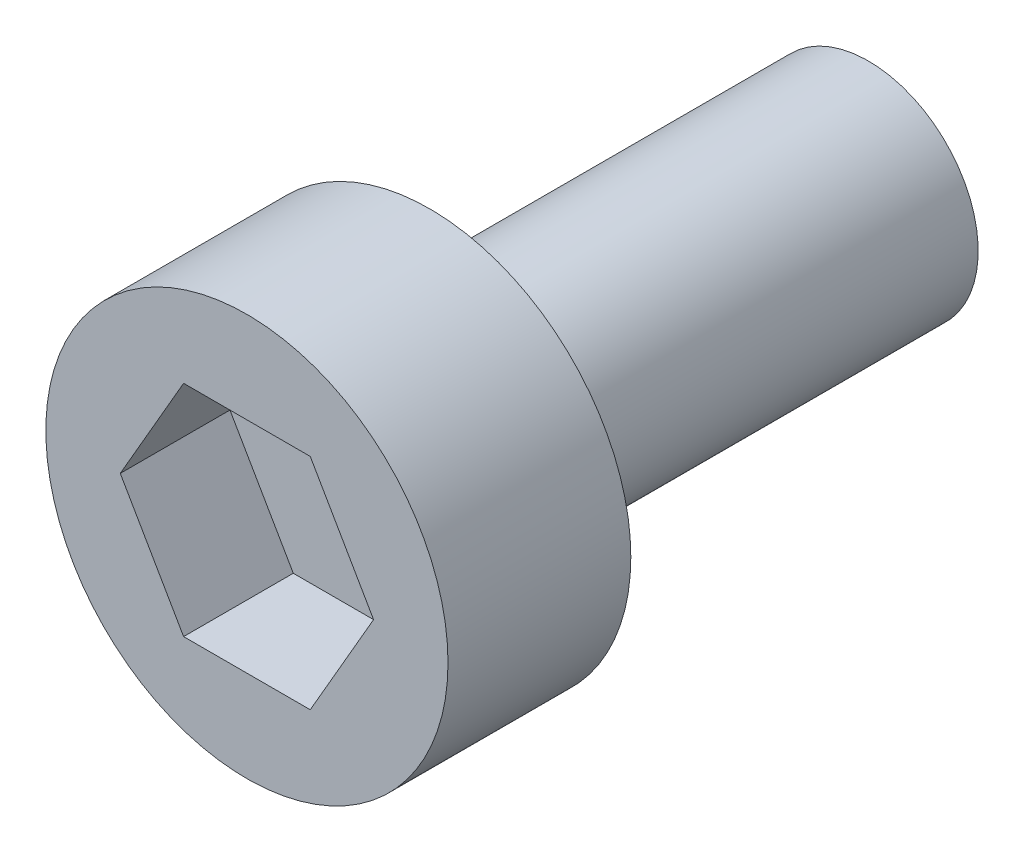
ISO-10303-21;
HEADER;
FILE_DESCRIPTION(('STEP AP214'),'2;1');
FILE_NAME('part.step','',(''),(''),'','','');
FILE_SCHEMA(('AUTOMOTIVE_DESIGN { 1 0 10303 214 1 1 1 1 }'));
ENDSEC;
DATA;
#1=APPLICATION_CONTEXT('core data for automotive mechanical design processes');
#2=APPLICATION_PROTOCOL_DEFINITION('international standard','automotive_design',2000,#1);
#3=PRODUCT_CONTEXT('',#1,'mechanical');
#4=PRODUCT('Part','Part','',(#3));
#5=PRODUCT_RELATED_PRODUCT_CATEGORY('part','',(#4));
#6=PRODUCT_DEFINITION_FORMATION('','',#4);
#7=PRODUCT_DEFINITION_CONTEXT('part definition',#1,'design');
#8=PRODUCT_DEFINITION('design','',#6,#7);
#9=PRODUCT_DEFINITION_SHAPE('','',#8);
#10=(LENGTH_UNIT() NAMED_UNIT(*) SI_UNIT(.MILLI.,.METRE.));
#11=(NAMED_UNIT(*) PLANE_ANGLE_UNIT() SI_UNIT($,.RADIAN.));
#12=(NAMED_UNIT(*) SI_UNIT($,.STERADIAN.) SOLID_ANGLE_UNIT());
#13=UNCERTAINTY_MEASURE_WITH_UNIT(LENGTH_MEASURE(1.E-05),#10,'distance_accuracy_value','');
#14=(GEOMETRIC_REPRESENTATION_CONTEXT(3) GLOBAL_UNCERTAINTY_ASSIGNED_CONTEXT((#13)) GLOBAL_UNIT_ASSIGNED_CONTEXT((#10,
#11,#12)) REPRESENTATION_CONTEXT('',''));
#15=CARTESIAN_POINT('',(0.,0.,0.));
#16=DIRECTION('',(0.,0.,1.));
#17=DIRECTION('',(1.,0.,0.));
#18=AXIS2_PLACEMENT_3D('',#15,#16,#17);
#19=CARTESIAN_POINT('',(0.866025403784438,-1.5,2.5));
#20=DIRECTION('',(-0.866025403784439,0.5,0.));
#21=DIRECTION('',(-0.5,-0.866025403784439,0.));
#22=AXIS2_PLACEMENT_3D('',#19,#20,#21);
#23=PLANE('',#22);
#24=DIRECTION('',(0.,0.,-1.));
#25=VECTOR('',#24,1.);
#26=CARTESIAN_POINT('',(1.73205080756888,0.,2.5));
#27=LINE('',#26,#25);
#28=CARTESIAN_POINT('',(1.73205080756888,0.,2.5));
#29=VERTEX_POINT('',#28);
#30=CARTESIAN_POINT('',(1.73205080756888,0.,1.));
#31=VERTEX_POINT('',#30);
#32=EDGE_CURVE('E115',#29,#31,#27,.T.);
#33=ORIENTED_EDGE('',*,*,#32,.T.);
#34=DIRECTION('',(-0.5,-0.866025403784439,0.));
#35=VECTOR('',#34,1.);
#36=CARTESIAN_POINT('',(1.29903810567666,-0.75,1.));
#37=LINE('',#36,#35);
#38=CARTESIAN_POINT('',(0.866025403784438,-1.5,1.));
#39=VERTEX_POINT('',#38);
#40=EDGE_CURVE('E176',#31,#39,#37,.T.);
#41=ORIENTED_EDGE('',*,*,#40,.T.);
#42=DIRECTION('',(0.,0.,-1.));
#43=VECTOR('',#42,1.);
#44=CARTESIAN_POINT('',(0.866025403784438,-1.5,2.5));
#45=LINE('',#44,#43);
#46=CARTESIAN_POINT('',(0.866025403784438,-1.5,2.5));
#47=VERTEX_POINT('',#46);
#48=EDGE_CURVE('E193',#47,#39,#45,.T.);
#49=ORIENTED_EDGE('',*,*,#48,.F.);
#50=DIRECTION('',(0.5,0.866025403784439,0.));
#51=VECTOR('',#50,1.);
#52=CARTESIAN_POINT('',(0.866025403784438,-1.5,2.5));
#53=LINE('',#52,#51);
#54=EDGE_CURVE('E182',#47,#29,#53,.T.);
#55=ORIENTED_EDGE('',*,*,#54,.T.);
#56=EDGE_LOOP('',(#33,#41,#49,#55));
#57=FACE_BOUND('',#56,.T.);
#58=ADVANCED_FACE('F36',(#57),#23,.T.);
#59=CARTESIAN_POINT('',(1.73205080756888,0.,2.5));
#60=DIRECTION('',(-0.866025403784438,-0.5,0.));
#61=DIRECTION('',(0.5,-0.866025403784438,0.));
#62=AXIS2_PLACEMENT_3D('',#59,#60,#61);
#63=PLANE('',#62);
#64=DIRECTION('',(0.,0.,-1.));
#65=VECTOR('',#64,1.);
#66=CARTESIAN_POINT('',(0.866025403784438,1.5,2.5));
#67=LINE('',#66,#65);
#68=CARTESIAN_POINT('',(0.866025403784438,1.5,2.5));
#69=VERTEX_POINT('',#68);
#70=CARTESIAN_POINT('',(0.866025403784438,1.5,1.));
#71=VERTEX_POINT('',#70);
#72=EDGE_CURVE('E113',#69,#71,#67,.T.);
#73=ORIENTED_EDGE('',*,*,#72,.T.);
#74=DIRECTION('',(0.5,-0.866025403784438,0.));
#75=VECTOR('',#74,1.);
#76=CARTESIAN_POINT('',(1.29903810567666,0.750000000000001,1.));
#77=LINE('',#76,#75);
#78=EDGE_CURVE('E94',#71,#31,#77,.T.);
#79=ORIENTED_EDGE('',*,*,#78,.T.);
#80=ORIENTED_EDGE('',*,*,#32,.F.);
#81=DIRECTION('',(-0.5,0.866025403784438,0.));
#82=VECTOR('',#81,1.);
#83=CARTESIAN_POINT('',(1.73205080756888,0.,2.5));
#84=LINE('',#83,#82);
#85=EDGE_CURVE('E184',#29,#69,#84,.T.);
#86=ORIENTED_EDGE('',*,*,#85,.T.);
#87=EDGE_LOOP('',(#73,#79,#80,#86));
#88=FACE_BOUND('',#87,.T.);
#89=ADVANCED_FACE('F141',(#88),#63,.T.);
#90=CARTESIAN_POINT('',(0.866025403784438,1.5,2.5));
#91=DIRECTION('',(0.,-1.,0.));
#92=DIRECTION('',(0.,0.,-1.));
#93=AXIS2_PLACEMENT_3D('',#90,#91,#92);
#94=PLANE('',#93);
#95=DIRECTION('',(0.,0.,-1.));
#96=VECTOR('',#95,1.);
#97=CARTESIAN_POINT('',(-0.866025403784439,1.5,2.5));
#98=LINE('',#97,#96);
#99=CARTESIAN_POINT('',(-0.866025403784439,1.5,2.5));
#100=VERTEX_POINT('',#99);
#101=CARTESIAN_POINT('',(-0.866025403784439,1.5,1.));
#102=VERTEX_POINT('',#101);
#103=EDGE_CURVE('E104',#100,#102,#98,.T.);
#104=ORIENTED_EDGE('',*,*,#103,.T.);
#105=DIRECTION('',(1.,0.,0.));
#106=VECTOR('',#105,1.);
#107=CARTESIAN_POINT('',(0.,1.5,1.));
#108=LINE('',#107,#106);
#109=EDGE_CURVE('E89',#102,#71,#108,.T.);
#110=ORIENTED_EDGE('',*,*,#109,.T.);
#111=ORIENTED_EDGE('',*,*,#72,.F.);
#112=DIRECTION('',(-1.,0.,0.));
#113=VECTOR('',#112,1.);
#114=CARTESIAN_POINT('',(0.866025403784438,1.5,2.5));
#115=LINE('',#114,#113);
#116=EDGE_CURVE('E112',#69,#100,#115,.T.);
#117=ORIENTED_EDGE('',*,*,#116,.T.);
#118=EDGE_LOOP('',(#104,#110,#111,#117));
#119=FACE_BOUND('',#118,.T.);
#120=ADVANCED_FACE('F110',(#119),#94,.T.);
#121=CARTESIAN_POINT('',(-0.866025403784439,1.5,2.5));
#122=DIRECTION('',(0.866025403784439,-0.5,0.));
#123=DIRECTION('',(0.5,0.866025403784439,0.));
#124=AXIS2_PLACEMENT_3D('',#121,#122,#123);
#125=PLANE('',#124);
#126=DIRECTION('',(0.,0.,-1.));
#127=VECTOR('',#126,1.);
#128=CARTESIAN_POINT('',(-1.73205080756888,0.,2.5));
#129=LINE('',#128,#127);
#130=CARTESIAN_POINT('',(-1.73205080756888,0.,2.5));
#131=VERTEX_POINT('',#130);
#132=CARTESIAN_POINT('',(-1.73205080756888,0.,1.));
#133=VERTEX_POINT('',#132);
#134=EDGE_CURVE('E107',#131,#133,#129,.T.);
#135=ORIENTED_EDGE('',*,*,#134,.T.);
#136=DIRECTION('',(0.5,0.866025403784439,0.));
#137=VECTOR('',#136,1.);
#138=CARTESIAN_POINT('',(-1.29903810567666,0.75,1.));
#139=LINE('',#138,#137);
#140=EDGE_CURVE('E92',#133,#102,#139,.T.);
#141=ORIENTED_EDGE('',*,*,#140,.T.);
#142=ORIENTED_EDGE('',*,*,#103,.F.);
#143=DIRECTION('',(-0.5,-0.866025403784439,0.));
#144=VECTOR('',#143,1.);
#145=CARTESIAN_POINT('',(-0.866025403784439,1.5,2.5));
#146=LINE('',#145,#144);
#147=EDGE_CURVE('E187',#100,#131,#146,.T.);
#148=ORIENTED_EDGE('',*,*,#147,.T.);
#149=EDGE_LOOP('',(#135,#141,#142,#148));
#150=FACE_BOUND('',#149,.T.);
#151=ADVANCED_FACE('F103',(#150),#125,.T.);
#152=CARTESIAN_POINT('',(-1.73205080756888,0.,2.5));
#153=DIRECTION('',(0.866025403784438,0.5,0.));
#154=DIRECTION('',(-0.5,0.866025403784439,0.));
#155=AXIS2_PLACEMENT_3D('',#152,#153,#154);
#156=PLANE('',#155);
#157=DIRECTION('',(0.,0.,-1.));
#158=VECTOR('',#157,1.);
#159=CARTESIAN_POINT('',(-0.866025403784438,-1.5,2.5));
#160=LINE('',#159,#158);
#161=CARTESIAN_POINT('',(-0.866025403784438,-1.5,2.5));
#162=VERTEX_POINT('',#161);
#163=CARTESIAN_POINT('',(-0.866025403784438,-1.5,1.));
#164=VERTEX_POINT('',#163);
#165=EDGE_CURVE('E60',#162,#164,#160,.T.);
#166=ORIENTED_EDGE('',*,*,#165,.T.);
#167=DIRECTION('',(-0.5,0.866025403784439,0.));
#168=VECTOR('',#167,1.);
#169=CARTESIAN_POINT('',(-1.29903810567666,-0.75,1.));
#170=LINE('',#169,#168);
#171=EDGE_CURVE('E53',#164,#133,#170,.T.);
#172=ORIENTED_EDGE('',*,*,#171,.T.);
#173=ORIENTED_EDGE('',*,*,#134,.F.);
#174=DIRECTION('',(0.5,-0.866025403784438,0.));
#175=VECTOR('',#174,1.);
#176=CARTESIAN_POINT('',(-1.73205080756888,0.,2.5));
#177=LINE('',#176,#175);
#178=EDGE_CURVE('E189',#131,#162,#177,.T.);
#179=ORIENTED_EDGE('',*,*,#178,.T.);
#180=EDGE_LOOP('',(#166,#172,#173,#179));
#181=FACE_BOUND('',#180,.T.);
#182=ADVANCED_FACE('F154',(#181),#156,.T.);
#183=CARTESIAN_POINT('',(-0.866025403784438,-1.5,2.5));
#184=DIRECTION('',(0.,1.,0.));
#185=DIRECTION('',(-1.,0.,0.));
#186=AXIS2_PLACEMENT_3D('',#183,#184,#185);
#187=PLANE('',#186);
#188=ORIENTED_EDGE('',*,*,#48,.T.);
#189=DIRECTION('',(-1.,0.,0.));
#190=VECTOR('',#189,1.);
#191=CARTESIAN_POINT('',(0.,-1.5,1.));
#192=LINE('',#191,#190);
#193=EDGE_CURVE('E179',#39,#164,#192,.T.);
#194=ORIENTED_EDGE('',*,*,#193,.T.);
#195=ORIENTED_EDGE('',*,*,#165,.F.);
#196=DIRECTION('',(1.,0.,0.));
#197=VECTOR('',#196,1.);
#198=CARTESIAN_POINT('',(-0.866025403784438,-1.5,2.5));
#199=LINE('',#198,#197);
#200=EDGE_CURVE('E191',#162,#47,#199,.T.);
#201=ORIENTED_EDGE('',*,*,#200,.T.);
#202=EDGE_LOOP('',(#188,#194,#195,#201));
#203=FACE_BOUND('',#202,.T.);
#204=ADVANCED_FACE('F137',(#203),#187,.T.);
#205=CARTESIAN_POINT('',(0.,0.,2.5));
#206=DIRECTION('',(0.,0.,1.));
#207=DIRECTION('',(1.,0.,0.));
#208=AXIS2_PLACEMENT_3D('',#205,#206,#207);
#209=PLANE('',#208);
#210=CARTESIAN_POINT('',(0.,0.,2.5));
#211=DIRECTION('',(0.,0.,1.));
#212=DIRECTION('',(1.,0.,0.));
#213=AXIS2_PLACEMENT_3D('',#210,#211,#212);
#214=CIRCLE('',#213,2.75);
#215=CARTESIAN_POINT('',(2.75,0.,2.5));
#216=VERTEX_POINT('',#215);
#217=EDGE_CURVE('E45',#216,#216,#214,.T.);
#218=ORIENTED_EDGE('',*,*,#217,.T.);
#219=EDGE_LOOP('',(#218));
#220=FACE_BOUND('',#219,.T.);
#221=ORIENTED_EDGE('',*,*,#85,.F.);
#222=ORIENTED_EDGE('',*,*,#54,.F.);
#223=ORIENTED_EDGE('',*,*,#200,.F.);
#224=ORIENTED_EDGE('',*,*,#178,.F.);
#225=ORIENTED_EDGE('',*,*,#147,.F.);
#226=ORIENTED_EDGE('',*,*,#116,.F.);
#227=EDGE_LOOP('',(#221,#222,#223,#224,#225,#226));
#228=FACE_BOUND('',#227,.T.);
#229=ADVANCED_FACE('F130',(#220,#228),#209,.T.);
#230=CARTESIAN_POINT('',(0.,0.,0.));
#231=DIRECTION('',(0.,0.,1.));
#232=DIRECTION('',(1.,0.,0.));
#233=AXIS2_PLACEMENT_3D('',#230,#231,#232);
#234=PLANE('',#233);
#235=CARTESIAN_POINT('',(0.,0.,0.));
#236=DIRECTION('',(0.,0.,-1.));
#237=DIRECTION('',(-1.,0.,0.));
#238=AXIS2_PLACEMENT_3D('',#235,#236,#237);
#239=CIRCLE('',#238,1.5);
#240=CARTESIAN_POINT('',(-1.5,0.,0.));
#241=VERTEX_POINT('',#240);
#242=EDGE_CURVE('E11',#241,#241,#239,.T.);
#243=ORIENTED_EDGE('',*,*,#242,.F.);
#244=EDGE_LOOP('',(#243));
#245=FACE_BOUND('',#244,.T.);
#246=CARTESIAN_POINT('',(0.,0.,0.));
#247=DIRECTION('',(0.,0.,1.));
#248=DIRECTION('',(1.,0.,0.));
#249=AXIS2_PLACEMENT_3D('',#246,#247,#248);
#250=CIRCLE('',#249,2.75);
#251=CARTESIAN_POINT('',(2.75,0.,0.));
#252=VERTEX_POINT('',#251);
#253=EDGE_CURVE('E40',#252,#252,#250,.T.);
#254=ORIENTED_EDGE('',*,*,#253,.F.);
#255=EDGE_LOOP('',(#254));
#256=FACE_BOUND('',#255,.T.);
#257=ADVANCED_FACE('F128',(#245,#256),#234,.F.);
#258=CARTESIAN_POINT('',(0.,0.,2.5));
#259=DIRECTION('',(0.,0.,-1.));
#260=DIRECTION('',(-1.,0.,0.));
#261=AXIS2_PLACEMENT_3D('',#258,#259,#260);
#262=CYLINDRICAL_SURFACE('',#261,2.75);
#263=ORIENTED_EDGE('',*,*,#217,.F.);
#264=EDGE_LOOP('',(#263));
#265=FACE_BOUND('',#264,.T.);
#266=ORIENTED_EDGE('',*,*,#253,.T.);
#267=EDGE_LOOP('',(#266));
#268=FACE_BOUND('',#267,.T.);
#269=ADVANCED_FACE('F38',(#265,#268),#262,.T.);
#270=CARTESIAN_POINT('',(0.,0.,1.));
#271=DIRECTION('',(0.,0.,-1.));
#272=DIRECTION('',(-1.,0.,0.));
#273=AXIS2_PLACEMENT_3D('',#270,#271,#272);
#274=PLANE('',#273);
#275=ORIENTED_EDGE('',*,*,#140,.F.);
#276=ORIENTED_EDGE('',*,*,#171,.F.);
#277=ORIENTED_EDGE('',*,*,#193,.F.);
#278=ORIENTED_EDGE('',*,*,#40,.F.);
#279=ORIENTED_EDGE('',*,*,#78,.F.);
#280=ORIENTED_EDGE('',*,*,#109,.F.);
#281=EDGE_LOOP('',(#275,#276,#277,#278,#279,#280));
#282=FACE_BOUND('',#281,.T.);
#283=ADVANCED_FACE('F91',(#282),#274,.F.);
#284=CARTESIAN_POINT('',(0.,0.,-6.));
#285=DIRECTION('',(0.,0.,1.));
#286=DIRECTION('',(1.,0.,0.));
#287=AXIS2_PLACEMENT_3D('',#284,#285,#286);
#288=CYLINDRICAL_SURFACE('',#287,1.5);
#289=CARTESIAN_POINT('',(0.,0.,-6.));
#290=DIRECTION('',(0.,0.,-1.));
#291=DIRECTION('',(-1.,0.,0.));
#292=AXIS2_PLACEMENT_3D('',#289,#290,#291);
#293=CIRCLE('',#292,1.5);
#294=CARTESIAN_POINT('',(-1.5,0.,-6.));
#295=VERTEX_POINT('',#294);
#296=EDGE_CURVE('E108',#295,#295,#293,.T.);
#297=ORIENTED_EDGE('',*,*,#296,.F.);
#298=EDGE_LOOP('',(#297));
#299=FACE_BOUND('',#298,.T.);
#300=ORIENTED_EDGE('',*,*,#242,.T.);
#301=EDGE_LOOP('',(#300));
#302=FACE_BOUND('',#301,.T.);
#303=ADVANCED_FACE('F162',(#299,#302),#288,.T.);
#304=CARTESIAN_POINT('',(0.,0.,-6.));
#305=DIRECTION('',(0.,0.,-1.));
#306=DIRECTION('',(-1.,0.,0.));
#307=AXIS2_PLACEMENT_3D('',#304,#305,#306);
#308=PLANE('',#307);
#309=ORIENTED_EDGE('',*,*,#296,.T.);
#310=EDGE_LOOP('',(#309));
#311=FACE_BOUND('',#310,.T.);
#312=ADVANCED_FACE('F165',(#311),#308,.T.);
#313=CLOSED_SHELL('',(#58,#89,#120,#151,#182,#204,#229,#257,#269,#283,#303,#312));
#314=MANIFOLD_SOLID_BREP('B2',#313);
#315=ADVANCED_BREP_SHAPE_REPRESENTATION('',(#18,#314),#14);
#316=SHAPE_DEFINITION_REPRESENTATION(#9,#315);
ENDSEC;
END-ISO-10303-21;
